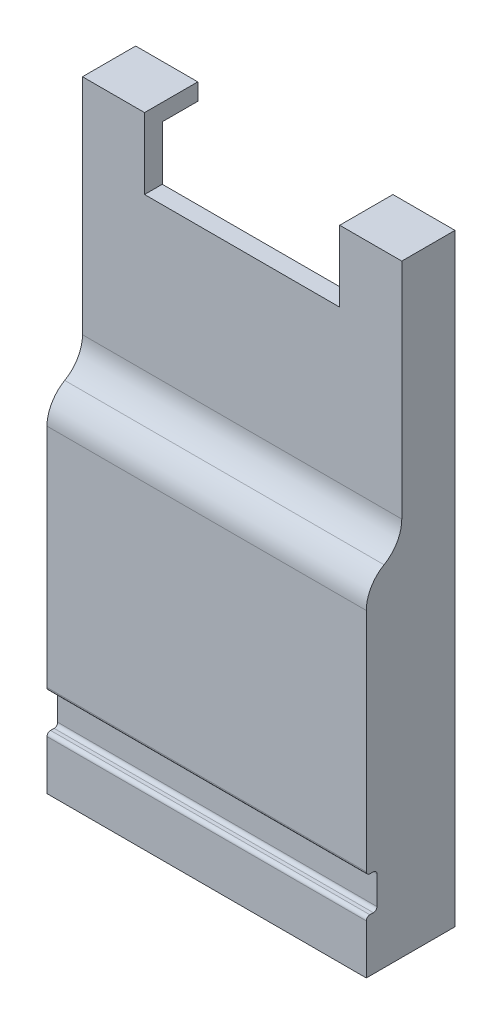
ISO-10303-21;
HEADER;
FILE_DESCRIPTION(('STEP AP214'),'2;1');
FILE_NAME('part.step','',(''),(''),'','','');
FILE_SCHEMA(('AUTOMOTIVE_DESIGN { 1 0 10303 214 1 1 1 1 }'));
ENDSEC;
DATA;
#1=APPLICATION_CONTEXT('core data for automotive mechanical design processes');
#2=APPLICATION_PROTOCOL_DEFINITION('international standard','automotive_design',2000,#1);
#3=PRODUCT_CONTEXT('',#1,'mechanical');
#4=PRODUCT('Part','Part','',(#3));
#5=PRODUCT_RELATED_PRODUCT_CATEGORY('part','',(#4));
#6=PRODUCT_DEFINITION_FORMATION('','',#4);
#7=PRODUCT_DEFINITION_CONTEXT('part definition',#1,'design');
#8=PRODUCT_DEFINITION('design','',#6,#7);
#9=PRODUCT_DEFINITION_SHAPE('','',#8);
#10=(LENGTH_UNIT() NAMED_UNIT(*) SI_UNIT(.MILLI.,.METRE.));
#11=(NAMED_UNIT(*) PLANE_ANGLE_UNIT() SI_UNIT($,.RADIAN.));
#12=(NAMED_UNIT(*) SI_UNIT($,.STERADIAN.) SOLID_ANGLE_UNIT());
#13=UNCERTAINTY_MEASURE_WITH_UNIT(LENGTH_MEASURE(1.E-05),#10,'distance_accuracy_value','');
#14=(GEOMETRIC_REPRESENTATION_CONTEXT(3) GLOBAL_UNCERTAINTY_ASSIGNED_CONTEXT((#13)) GLOBAL_UNIT_ASSIGNED_CONTEXT((#10,
#11,#12)) REPRESENTATION_CONTEXT('',''));
#15=CARTESIAN_POINT('',(0.,0.,0.));
#16=DIRECTION('',(0.,0.,1.));
#17=DIRECTION('',(1.,0.,0.));
#18=AXIS2_PLACEMENT_3D('',#15,#16,#17);
#19=CARTESIAN_POINT('',(40.25,80.25,10.));
#20=DIRECTION('',(0.,1.,0.));
#21=DIRECTION('',(0.,0.,1.));
#22=AXIS2_PLACEMENT_3D('',#19,#20,#21);
#23=PLANE('',#22);
#24=DIRECTION('',(1.,0.,0.));
#25=VECTOR('',#24,1.);
#26=CARTESIAN_POINT('',(40.25,80.25,10.));
#27=LINE('',#26,#25);
#28=CARTESIAN_POINT('',(27.5,80.25,10.));
#29=VERTEX_POINT('',#28);
#30=CARTESIAN_POINT('',(40.25,80.25,10.));
#31=VERTEX_POINT('',#30);
#32=EDGE_CURVE('E366',#29,#31,#27,.T.);
#33=ORIENTED_EDGE('',*,*,#32,.F.);
#34=DIRECTION('',(0.,0.,-1.));
#35=VECTOR('',#34,1.);
#36=CARTESIAN_POINT('',(27.5,80.25,10.));
#37=LINE('',#36,#35);
#38=CARTESIAN_POINT('',(27.5,80.25,0.));
#39=VERTEX_POINT('',#38);
#40=EDGE_CURVE('E285',#29,#39,#37,.T.);
#41=ORIENTED_EDGE('',*,*,#40,.T.);
#42=DIRECTION('',(1.,0.,0.));
#43=VECTOR('',#42,1.);
#44=CARTESIAN_POINT('',(40.25,80.25,0.));
#45=LINE('',#44,#43);
#46=CARTESIAN_POINT('',(40.25,80.25,0.));
#47=VERTEX_POINT('',#46);
#48=EDGE_CURVE('E380',#39,#47,#45,.T.);
#49=ORIENTED_EDGE('',*,*,#48,.T.);
#50=DIRECTION('',(0.,0.,-1.));
#51=VECTOR('',#50,1.);
#52=CARTESIAN_POINT('',(40.25,80.25,10.));
#53=LINE('',#52,#51);
#54=CARTESIAN_POINT('',(40.25,80.25,8.20000000000002));
#55=VERTEX_POINT('',#54);
#56=EDGE_CURVE('E398',#55,#47,#53,.T.);
#57=ORIENTED_EDGE('',*,*,#56,.F.);
#58=DIRECTION('',(1.,0.,0.));
#59=VECTOR('',#58,1.);
#60=CARTESIAN_POINT('',(39.35,80.25,8.20000000000002));
#61=LINE('',#60,#59);
#62=CARTESIAN_POINT('',(39.35,80.25,8.20000000000002));
#63=VERTEX_POINT('',#62);
#64=EDGE_CURVE('E359',#63,#55,#61,.T.);
#65=ORIENTED_EDGE('',*,*,#64,.F.);
#66=DIRECTION('',(0.,0.,-1.));
#67=VECTOR('',#66,1.);
#68=CARTESIAN_POINT('',(39.35,80.25,8.20000000000002));
#69=LINE('',#68,#67);
#70=CARTESIAN_POINT('',(39.35,80.25,8.80000000000002));
#71=VERTEX_POINT('',#70);
#72=EDGE_CURVE('E336',#71,#63,#69,.T.);
#73=ORIENTED_EDGE('',*,*,#72,.F.);
#74=DIRECTION('',(1.,0.,0.));
#75=VECTOR('',#74,1.);
#76=CARTESIAN_POINT('',(39.35,80.25,8.8));
#77=LINE('',#76,#75);
#78=CARTESIAN_POINT('',(40.25,80.25,8.80000000000002));
#79=VERTEX_POINT('',#78);
#80=EDGE_CURVE('E347',#71,#79,#77,.T.);
#81=ORIENTED_EDGE('',*,*,#80,.T.);
#82=EDGE_CURVE('E395',#31,#79,#53,.T.);
#83=ORIENTED_EDGE('',*,*,#82,.F.);
#84=EDGE_LOOP('',(#33,#41,#49,#57,#65,#73,#81,#83));
#85=FACE_BOUND('',#84,.T.);
#86=ADVANCED_FACE('F39',(#85),#23,.F.);
#87=CARTESIAN_POINT('',(-45.,85.,25.));
#88=DIRECTION('',(0.,-1.,0.));
#89=DIRECTION('',(0.,0.,-1.));
#90=AXIS2_PLACEMENT_3D('',#87,#88,#89);
#91=PLANE('',#90);
#92=DIRECTION('',(-1.,0.,0.));
#93=VECTOR('',#92,1.);
#94=CARTESIAN_POINT('',(-45.,85.,0.));
#95=LINE('',#94,#93);
#96=CARTESIAN_POINT('',(45.,85.,0.));
#97=VERTEX_POINT('',#96);
#98=CARTESIAN_POINT('',(27.5,85.,0.));
#99=VERTEX_POINT('',#98);
#100=EDGE_CURVE('E424',#97,#99,#95,.T.);
#101=ORIENTED_EDGE('',*,*,#100,.T.);
#102=DIRECTION('',(0.,0.,1.));
#103=VECTOR('',#102,1.);
#104=CARTESIAN_POINT('',(27.5,85.,25.));
#105=LINE('',#104,#103);
#106=CARTESIAN_POINT('',(27.5,85.,15.));
#107=VERTEX_POINT('',#106);
#108=EDGE_CURVE('E290',#99,#107,#105,.T.);
#109=ORIENTED_EDGE('',*,*,#108,.T.);
#110=DIRECTION('',(-1.,0.,0.));
#111=VECTOR('',#110,1.);
#112=CARTESIAN_POINT('',(45.,85.,15.));
#113=LINE('',#112,#111);
#114=CARTESIAN_POINT('',(45.,85.,15.));
#115=VERTEX_POINT('',#114);
#116=EDGE_CURVE('E404',#115,#107,#113,.T.);
#117=ORIENTED_EDGE('',*,*,#116,.F.);
#118=DIRECTION('',(0.,0.,-1.));
#119=VECTOR('',#118,1.);
#120=CARTESIAN_POINT('',(45.,85.,25.));
#121=LINE('',#120,#119);
#122=EDGE_CURVE('E441',#115,#97,#121,.T.);
#123=ORIENTED_EDGE('',*,*,#122,.T.);
#124=EDGE_LOOP('',(#101,#109,#117,#123));
#125=FACE_BOUND('',#124,.T.);
#126=ADVANCED_FACE('F534',(#125),#91,.F.);
#127=CARTESIAN_POINT('',(0.,0.,0.));
#128=DIRECTION('',(0.,0.,-1.));
#129=DIRECTION('',(-1.,0.,0.));
#130=AXIS2_PLACEMENT_3D('',#127,#128,#129);
#131=PLANE('',#130);
#132=DIRECTION('',(0.,-1.,0.));
#133=VECTOR('',#132,1.);
#134=CARTESIAN_POINT('',(27.5,0.,0.));
#135=LINE('',#134,#133);
#136=EDGE_CURVE('E288',#99,#39,#135,.T.);
#137=ORIENTED_EDGE('',*,*,#136,.F.);
#138=ORIENTED_EDGE('',*,*,#100,.F.);
#139=DIRECTION('',(0.,1.,0.));
#140=VECTOR('',#139,1.);
#141=CARTESIAN_POINT('',(45.,-85.,0.));
#142=LINE('',#141,#140);
#143=CARTESIAN_POINT('',(45.,-85.,0.));
#144=VERTEX_POINT('',#143);
#145=EDGE_CURVE('E409',#144,#97,#142,.T.);
#146=ORIENTED_EDGE('',*,*,#145,.F.);
#147=DIRECTION('',(1.,0.,0.));
#148=VECTOR('',#147,1.);
#149=CARTESIAN_POINT('',(-45.,-85.,0.));
#150=LINE('',#149,#148);
#151=CARTESIAN_POINT('',(40.25,-85.,0.));
#152=VERTEX_POINT('',#151);
#153=EDGE_CURVE('E429',#152,#144,#150,.T.);
#154=ORIENTED_EDGE('',*,*,#153,.F.);
#155=DIRECTION('',(0.,-1.,0.));
#156=VECTOR('',#155,1.);
#157=CARTESIAN_POINT('',(40.25,-85.,0.));
#158=LINE('',#157,#156);
#159=EDGE_CURVE('E367',#47,#152,#158,.T.);
#160=ORIENTED_EDGE('',*,*,#159,.F.);
#161=ORIENTED_EDGE('',*,*,#48,.F.);
#162=EDGE_LOOP('',(#137,#138,#146,#154,#160,#161));
#163=FACE_BOUND('',#162,.T.);
#164=ADVANCED_FACE('F537',(#163),#131,.T.);
#165=CARTESIAN_POINT('',(0.,0.,25.));
#166=DIRECTION('',(0.,0.,-1.));
#167=DIRECTION('',(-1.,0.,0.));
#168=AXIS2_PLACEMENT_3D('',#165,#166,#167);
#169=PLANE('',#168);
#170=DIRECTION('',(0.,-1.,0.));
#171=VECTOR('',#170,1.);
#172=CARTESIAN_POINT('',(-45.,-85.,25.));
#173=LINE('',#172,#171);
#174=CARTESIAN_POINT('',(-45.,4.70769186227474,25.));
#175=VERTEX_POINT('',#174);
#176=CARTESIAN_POINT('',(-45.,-59.0642013911507,25.));
#177=VERTEX_POINT('',#176);
#178=EDGE_CURVE('E415',#175,#177,#173,.T.);
#179=ORIENTED_EDGE('',*,*,#178,.T.);
#180=DIRECTION('',(-1.,0.,0.));
#181=VECTOR('',#180,1.);
#182=CARTESIAN_POINT('',(0.,-59.0642013911507,25.));
#183=LINE('',#182,#181);
#184=CARTESIAN_POINT('',(45.,-59.0642013911507,25.));
#185=VERTEX_POINT('',#184);
#186=EDGE_CURVE('E470',#177,#185,#183,.F.);
#187=ORIENTED_EDGE('',*,*,#186,.T.);
#188=DIRECTION('',(0.,1.,0.));
#189=VECTOR('',#188,1.);
#190=CARTESIAN_POINT('',(45.,-85.,25.));
#191=LINE('',#190,#189);
#192=CARTESIAN_POINT('',(45.,4.70769186227475,25.));
#193=VERTEX_POINT('',#192);
#194=EDGE_CURVE('E414',#185,#193,#191,.T.);
#195=ORIENTED_EDGE('',*,*,#194,.T.);
#196=DIRECTION('',(1.,0.,0.));
#197=VECTOR('',#196,1.);
#198=CARTESIAN_POINT('',(0.,4.70769186227474,25.));
#199=LINE('',#198,#197);
#200=EDGE_CURVE('E446',#193,#175,#199,.F.);
#201=ORIENTED_EDGE('',*,*,#200,.T.);
#202=EDGE_LOOP('',(#179,#187,#195,#201));
#203=FACE_BOUND('',#202,.T.);
#204=ADVANCED_FACE('F606',(#203),#169,.F.);
#205=CARTESIAN_POINT('',(-40.25,-85.,10.));
#206=DIRECTION('',(-1.,0.,0.));
#207=DIRECTION('',(0.,0.,1.));
#208=AXIS2_PLACEMENT_3D('',#205,#206,#207);
#209=PLANE('',#208);
#210=DIRECTION('',(0.,0.,-1.));
#211=VECTOR('',#210,1.);
#212=CARTESIAN_POINT('',(-40.25,-85.,10.));
#213=LINE('',#212,#211);
#214=CARTESIAN_POINT('',(-40.25,-85.,10.));
#215=VERTEX_POINT('',#214);
#216=CARTESIAN_POINT('',(-40.25,-85.,9.39999999999998));
#217=VERTEX_POINT('',#216);
#218=EDGE_CURVE('E386',#215,#217,#213,.T.);
#219=ORIENTED_EDGE('',*,*,#218,.T.);
#220=DIRECTION('',(0.,1.,0.));
#221=VECTOR('',#220,1.);
#222=CARTESIAN_POINT('',(-40.25,-85.,9.39999999999998));
#223=LINE('',#222,#221);
#224=CARTESIAN_POINT('',(-40.25,80.25,9.39999999999998));
#225=VERTEX_POINT('',#224);
#226=EDGE_CURVE('E314',#217,#225,#223,.T.);
#227=ORIENTED_EDGE('',*,*,#226,.T.);
#228=DIRECTION('',(0.,0.,-1.));
#229=VECTOR('',#228,1.);
#230=CARTESIAN_POINT('',(-40.25,80.25,10.));
#231=LINE('',#230,#229);
#232=CARTESIAN_POINT('',(-40.25,80.25,10.));
#233=VERTEX_POINT('',#232);
#234=EDGE_CURVE('E399',#233,#225,#231,.T.);
#235=ORIENTED_EDGE('',*,*,#234,.F.);
#236=DIRECTION('',(0.,1.,0.));
#237=VECTOR('',#236,1.);
#238=CARTESIAN_POINT('',(-40.25,-85.,10.));
#239=LINE('',#238,#237);
#240=EDGE_CURVE('E363',#215,#233,#239,.T.);
#241=ORIENTED_EDGE('',*,*,#240,.F.);
#242=EDGE_LOOP('',(#219,#227,#235,#241));
#243=FACE_BOUND('',#242,.T.);
#244=ADVANCED_FACE('F557',(#243),#209,.F.);
#245=CARTESIAN_POINT('',(40.25,-85.,10.));
#246=DIRECTION('',(1.,0.,0.));
#247=DIRECTION('',(0.,0.,-1.));
#248=AXIS2_PLACEMENT_3D('',#245,#246,#247);
#249=PLANE('',#248);
#250=DIRECTION('',(0.,-1.,0.));
#251=VECTOR('',#250,1.);
#252=CARTESIAN_POINT('',(40.25,-85.,8.20000000000002));
#253=LINE('',#252,#251);
#254=CARTESIAN_POINT('',(40.25,-85.,8.20000000000002));
#255=VERTEX_POINT('',#254);
#256=EDGE_CURVE('E329',#55,#255,#253,.T.);
#257=ORIENTED_EDGE('',*,*,#256,.F.);
#258=ORIENTED_EDGE('',*,*,#56,.T.);
#259=ORIENTED_EDGE('',*,*,#159,.T.);
#260=DIRECTION('',(0.,0.,-1.));
#261=VECTOR('',#260,1.);
#262=CARTESIAN_POINT('',(40.25,-85.,10.));
#263=LINE('',#262,#261);
#264=EDGE_CURVE('E394',#255,#152,#263,.T.);
#265=ORIENTED_EDGE('',*,*,#264,.F.);
#266=EDGE_LOOP('',(#257,#258,#259,#265));
#267=FACE_BOUND('',#266,.T.);
#268=ADVANCED_FACE('F638',(#267),#249,.F.);
#269=DIRECTION('',(0.,1.,0.));
#270=VECTOR('',#269,1.);
#271=CARTESIAN_POINT('',(40.25,80.25,8.8));
#272=LINE('',#271,#270);
#273=CARTESIAN_POINT('',(40.25,-85.,8.80000000000001));
#274=VERTEX_POINT('',#273);
#275=EDGE_CURVE('E340',#274,#79,#272,.T.);
#276=ORIENTED_EDGE('',*,*,#275,.F.);
#277=CARTESIAN_POINT('',(40.25,-85.,10.));
#278=VERTEX_POINT('',#277);
#279=EDGE_CURVE('E391',#278,#274,#263,.T.);
#280=ORIENTED_EDGE('',*,*,#279,.F.);
#281=DIRECTION('',(0.,-1.,0.));
#282=VECTOR('',#281,1.);
#283=CARTESIAN_POINT('',(40.25,-85.,10.));
#284=LINE('',#283,#282);
#285=EDGE_CURVE('E371',#31,#278,#284,.T.);
#286=ORIENTED_EDGE('',*,*,#285,.F.);
#287=ORIENTED_EDGE('',*,*,#82,.T.);
#288=EDGE_LOOP('',(#276,#280,#286,#287));
#289=FACE_BOUND('',#288,.T.);
#290=ADVANCED_FACE('F631',(#289),#249,.F.);
#291=CARTESIAN_POINT('',(-40.25,80.25,0.));
#292=VERTEX_POINT('',#291);
#293=CARTESIAN_POINT('',(-27.5,80.25,0.));
#294=VERTEX_POINT('',#293);
#295=EDGE_CURVE('E381',#292,#294,#45,.T.);
#296=ORIENTED_EDGE('',*,*,#295,.T.);
#297=DIRECTION('',(0.,0.,1.));
#298=VECTOR('',#297,1.);
#299=CARTESIAN_POINT('',(-27.5,80.25,10.));
#300=LINE('',#299,#298);
#301=CARTESIAN_POINT('',(-27.5,80.25,10.));
#302=VERTEX_POINT('',#301);
#303=EDGE_CURVE('E278',#294,#302,#300,.T.);
#304=ORIENTED_EDGE('',*,*,#303,.T.);
#305=EDGE_CURVE('E368',#233,#302,#27,.T.);
#306=ORIENTED_EDGE('',*,*,#305,.F.);
#307=ORIENTED_EDGE('',*,*,#234,.T.);
#308=DIRECTION('',(-1.,0.,0.));
#309=VECTOR('',#308,1.);
#310=CARTESIAN_POINT('',(-39.35,80.25,9.39999999999998));
#311=LINE('',#310,#309);
#312=CARTESIAN_POINT('',(-39.35,80.25,9.39999999999998));
#313=VERTEX_POINT('',#312);
#314=EDGE_CURVE('E327',#313,#225,#311,.T.);
#315=ORIENTED_EDGE('',*,*,#314,.F.);
#316=DIRECTION('',(0.,0.,-1.));
#317=VECTOR('',#316,1.);
#318=CARTESIAN_POINT('',(-39.35,80.25,9.39999999999998));
#319=LINE('',#318,#317);
#320=CARTESIAN_POINT('',(-39.35,80.25,8.8));
#321=VERTEX_POINT('',#320);
#322=EDGE_CURVE('E310',#313,#321,#319,.T.);
#323=ORIENTED_EDGE('',*,*,#322,.T.);
#324=DIRECTION('',(-1.,0.,0.));
#325=VECTOR('',#324,1.);
#326=CARTESIAN_POINT('',(-39.35,80.25,8.8));
#327=LINE('',#326,#325);
#328=CARTESIAN_POINT('',(-40.25,80.25,8.8));
#329=VERTEX_POINT('',#328);
#330=EDGE_CURVE('E322',#321,#329,#327,.T.);
#331=ORIENTED_EDGE('',*,*,#330,.T.);
#332=EDGE_CURVE('E377',#329,#292,#231,.T.);
#333=ORIENTED_EDGE('',*,*,#332,.T.);
#334=EDGE_LOOP('',(#296,#304,#306,#307,#315,#323,#331,#333));
#335=FACE_BOUND('',#334,.T.);
#336=ADVANCED_FACE('F503',(#335),#23,.F.);
#337=CARTESIAN_POINT('',(45.,-85.,25.));
#338=DIRECTION('',(-1.,0.,0.));
#339=DIRECTION('',(0.,0.,1.));
#340=AXIS2_PLACEMENT_3D('',#337,#338,#339);
#341=PLANE('',#340);
#342=DIRECTION('',(0.,0.,1.));
#343=VECTOR('',#342,1.);
#344=CARTESIAN_POINT('',(45.,-70.0642013911507,22.));
#345=LINE('',#344,#343);
#346=CARTESIAN_POINT('',(45.,-70.0642013911507,23.));
#347=VERTEX_POINT('',#346);
#348=CARTESIAN_POINT('',(45.,-70.0642013911507,24.));
#349=VERTEX_POINT('',#348);
#350=EDGE_CURVE('E305',#347,#349,#345,.T.);
#351=ORIENTED_EDGE('',*,*,#350,.T.);
#352=CARTESIAN_POINT('',(45.,-71.0642013911507,24.));
#353=DIRECTION('',(-1.,0.,0.));
#354=DIRECTION('',(0.,0.,1.));
#355=AXIS2_PLACEMENT_3D('',#352,#353,#354);
#356=CIRCLE('',#355,1.);
#357=CARTESIAN_POINT('',(45.,-71.0642013911507,25.));
#358=VERTEX_POINT('',#357);
#359=EDGE_CURVE('E484',#349,#358,#356,.F.);
#360=ORIENTED_EDGE('',*,*,#359,.T.);
#361=CARTESIAN_POINT('',(45.,-85.,25.));
#362=VERTEX_POINT('',#361);
#363=EDGE_CURVE('E410',#362,#358,#191,.T.);
#364=ORIENTED_EDGE('',*,*,#363,.F.);
#365=DIRECTION('',(0.,0.,-1.));
#366=VECTOR('',#365,1.);
#367=CARTESIAN_POINT('',(45.,-85.,25.));
#368=LINE('',#367,#366);
#369=EDGE_CURVE('E420',#362,#144,#368,.T.);
#370=ORIENTED_EDGE('',*,*,#369,.T.);
#371=ORIENTED_EDGE('',*,*,#145,.T.);
#372=ORIENTED_EDGE('',*,*,#122,.F.);
#373=DIRECTION('',(0.,1.,0.));
#374=VECTOR('',#373,1.);
#375=CARTESIAN_POINT('',(45.,85.,15.));
#376=LINE('',#375,#374);
#377=CARTESIAN_POINT('',(45.,22.0281999379635,15.));
#378=VERTEX_POINT('',#377);
#379=EDGE_CURVE('E389',#378,#115,#376,.T.);
#380=ORIENTED_EDGE('',*,*,#379,.F.);
#381=CARTESIAN_POINT('',(45.,22.0281999379635,25.));
#382=DIRECTION('',(-1.,0.,0.));
#383=DIRECTION('',(0.,0.,1.));
#384=AXIS2_PLACEMENT_3D('',#381,#382,#383);
#385=CIRCLE('',#384,10.);
#386=CARTESIAN_POINT('',(45.,13.3679459001191,20.));
#387=VERTEX_POINT('',#386);
#388=EDGE_CURVE('E456',#378,#387,#385,.T.);
#389=ORIENTED_EDGE('',*,*,#388,.T.);
#390=CARTESIAN_POINT('',(45.,4.70769186227474,15.));
#391=DIRECTION('',(-1.,0.,0.));
#392=DIRECTION('',(0.,0.,1.));
#393=AXIS2_PLACEMENT_3D('',#390,#391,#392);
#394=CIRCLE('',#393,10.);
#395=EDGE_CURVE('E443',#387,#193,#394,.F.);
#396=ORIENTED_EDGE('',*,*,#395,.T.);
#397=ORIENTED_EDGE('',*,*,#194,.F.);
#398=CARTESIAN_POINT('',(45.,-59.0642013911507,24.));
#399=DIRECTION('',(-1.,0.,0.));
#400=DIRECTION('',(0.,0.,1.));
#401=AXIS2_PLACEMENT_3D('',#398,#399,#400);
#402=CIRCLE('',#401,1.);
#403=CARTESIAN_POINT('',(45.,-60.0642013911507,24.));
#404=VERTEX_POINT('',#403);
#405=EDGE_CURVE('E472',#185,#404,#402,.F.);
#406=ORIENTED_EDGE('',*,*,#405,.T.);
#407=DIRECTION('',(0.,0.,1.));
#408=VECTOR('',#407,1.);
#409=CARTESIAN_POINT('',(45.,-60.0642013911507,22.));
#410=LINE('',#409,#408);
#411=CARTESIAN_POINT('',(45.,-60.0642013911507,23.));
#412=VERTEX_POINT('',#411);
#413=EDGE_CURVE('E302',#412,#404,#410,.T.);
#414=ORIENTED_EDGE('',*,*,#413,.F.);
#415=CARTESIAN_POINT('',(45.,-61.0642013911507,23.));
#416=DIRECTION('',(-1.,0.,0.));
#417=DIRECTION('',(0.,0.,1.));
#418=AXIS2_PLACEMENT_3D('',#415,#416,#417);
#419=CIRCLE('',#418,1.);
#420=CARTESIAN_POINT('',(45.,-61.0642013911507,22.));
#421=VERTEX_POINT('',#420);
#422=EDGE_CURVE('E476',#412,#421,#419,.T.);
#423=ORIENTED_EDGE('',*,*,#422,.T.);
#424=DIRECTION('',(0.,1.,0.));
#425=VECTOR('',#424,1.);
#426=CARTESIAN_POINT('',(45.,-70.0642013911507,22.));
#427=LINE('',#426,#425);
#428=CARTESIAN_POINT('',(45.,-69.0642013911507,22.));
#429=VERTEX_POINT('',#428);
#430=EDGE_CURVE('E295',#429,#421,#427,.T.);
#431=ORIENTED_EDGE('',*,*,#430,.F.);
#432=CARTESIAN_POINT('',(45.,-69.0642013911507,23.));
#433=DIRECTION('',(-1.,0.,0.));
#434=DIRECTION('',(0.,0.,1.));
#435=AXIS2_PLACEMENT_3D('',#432,#433,#434);
#436=CIRCLE('',#435,1.);
#437=EDGE_CURVE('E493',#429,#347,#436,.T.);
#438=ORIENTED_EDGE('',*,*,#437,.T.);
#439=EDGE_LOOP('',(#351,#360,#364,#370,#371,#372,#380,#389,#396,#397,#406,#414,#423,#431,#438));
#440=FACE_BOUND('',#439,.T.);
#441=ADVANCED_FACE('F529',(#440),#341,.F.);
#442=CARTESIAN_POINT('',(-27.5,85.,15.));
#443=VERTEX_POINT('',#442);
#444=CARTESIAN_POINT('',(-45.,85.,15.));
#445=VERTEX_POINT('',#444);
#446=EDGE_CURVE('E403',#443,#445,#113,.T.);
#447=ORIENTED_EDGE('',*,*,#446,.F.);
#448=DIRECTION('',(0.,0.,-1.));
#449=VECTOR('',#448,1.);
#450=CARTESIAN_POINT('',(-27.5,85.,25.));
#451=LINE('',#450,#449);
#452=CARTESIAN_POINT('',(-27.5,85.,0.));
#453=VERTEX_POINT('',#452);
#454=EDGE_CURVE('E268',#443,#453,#451,.T.);
#455=ORIENTED_EDGE('',*,*,#454,.T.);
#456=CARTESIAN_POINT('',(-45.,85.,0.));
#457=VERTEX_POINT('',#456);
#458=EDGE_CURVE('E423',#453,#457,#95,.T.);
#459=ORIENTED_EDGE('',*,*,#458,.T.);
#460=DIRECTION('',(0.,0.,-1.));
#461=VECTOR('',#460,1.);
#462=CARTESIAN_POINT('',(-45.,85.,25.));
#463=LINE('',#462,#461);
#464=EDGE_CURVE('E438',#445,#457,#463,.T.);
#465=ORIENTED_EDGE('',*,*,#464,.F.);
#466=EDGE_LOOP('',(#447,#455,#459,#465));
#467=FACE_BOUND('',#466,.T.);
#468=ADVANCED_FACE('F513',(#467),#91,.F.);
#469=CARTESIAN_POINT('',(-45.,-85.,25.));
#470=DIRECTION('',(1.,0.,0.));
#471=DIRECTION('',(0.,0.,-1.));
#472=AXIS2_PLACEMENT_3D('',#469,#470,#471);
#473=PLANE('',#472);
#474=CARTESIAN_POINT('',(-45.,-71.0642013911507,25.));
#475=VERTEX_POINT('',#474);
#476=CARTESIAN_POINT('',(-45.,-85.,25.));
#477=VERTEX_POINT('',#476);
#478=EDGE_CURVE('E413',#475,#477,#173,.T.);
#479=ORIENTED_EDGE('',*,*,#478,.F.);
#480=CARTESIAN_POINT('',(-45.,-71.0642013911507,24.));
#481=DIRECTION('',(1.,0.,0.));
#482=DIRECTION('',(0.,0.,-1.));
#483=AXIS2_PLACEMENT_3D('',#480,#481,#482);
#484=CIRCLE('',#483,1.);
#485=CARTESIAN_POINT('',(-45.,-70.0642013911507,24.));
#486=VERTEX_POINT('',#485);
#487=EDGE_CURVE('E488',#475,#486,#484,.F.);
#488=ORIENTED_EDGE('',*,*,#487,.T.);
#489=DIRECTION('',(0.,0.,1.));
#490=VECTOR('',#489,1.);
#491=CARTESIAN_POINT('',(-45.,-70.0642013911507,22.));
#492=LINE('',#491,#490);
#493=CARTESIAN_POINT('',(-45.,-70.0642013911507,23.));
#494=VERTEX_POINT('',#493);
#495=EDGE_CURVE('E297',#494,#486,#492,.T.);
#496=ORIENTED_EDGE('',*,*,#495,.F.);
#497=CARTESIAN_POINT('',(-45.,-69.0642013911507,23.));
#498=DIRECTION('',(1.,0.,0.));
#499=DIRECTION('',(0.,0.,-1.));
#500=AXIS2_PLACEMENT_3D('',#497,#498,#499);
#501=CIRCLE('',#500,1.);
#502=CARTESIAN_POINT('',(-45.,-69.0642013911507,22.));
#503=VERTEX_POINT('',#502);
#504=EDGE_CURVE('E62',#494,#503,#501,.T.);
#505=ORIENTED_EDGE('',*,*,#504,.T.);
#506=DIRECTION('',(0.,-1.,0.));
#507=VECTOR('',#506,1.);
#508=CARTESIAN_POINT('',(-45.,-70.0642013911507,22.));
#509=LINE('',#508,#507);
#510=CARTESIAN_POINT('',(-45.,-61.0642013911507,22.));
#511=VERTEX_POINT('',#510);
#512=EDGE_CURVE('E293',#511,#503,#509,.T.);
#513=ORIENTED_EDGE('',*,*,#512,.F.);
#514=CARTESIAN_POINT('',(-45.,-61.0642013911507,23.));
#515=DIRECTION('',(1.,0.,0.));
#516=DIRECTION('',(0.,0.,-1.));
#517=AXIS2_PLACEMENT_3D('',#514,#515,#516);
#518=CIRCLE('',#517,1.);
#519=CARTESIAN_POINT('',(-45.,-60.0642013911507,23.));
#520=VERTEX_POINT('',#519);
#521=EDGE_CURVE('E474',#511,#520,#518,.T.);
#522=ORIENTED_EDGE('',*,*,#521,.T.);
#523=DIRECTION('',(0.,0.,1.));
#524=VECTOR('',#523,1.);
#525=CARTESIAN_POINT('',(-45.,-60.0642013911507,22.));
#526=LINE('',#525,#524);
#527=CARTESIAN_POINT('',(-45.,-60.0642013911507,24.));
#528=VERTEX_POINT('',#527);
#529=EDGE_CURVE('E298',#520,#528,#526,.T.);
#530=ORIENTED_EDGE('',*,*,#529,.T.);
#531=CARTESIAN_POINT('',(-45.,-59.0642013911507,24.));
#532=DIRECTION('',(1.,0.,0.));
#533=DIRECTION('',(0.,0.,-1.));
#534=AXIS2_PLACEMENT_3D('',#531,#532,#533);
#535=CIRCLE('',#534,1.);
#536=EDGE_CURVE('E468',#528,#177,#535,.F.);
#537=ORIENTED_EDGE('',*,*,#536,.T.);
#538=ORIENTED_EDGE('',*,*,#178,.F.);
#539=CARTESIAN_POINT('',(-45.,4.70769186227473,15.));
#540=DIRECTION('',(1.,0.,0.));
#541=DIRECTION('',(0.,0.,-1.));
#542=AXIS2_PLACEMENT_3D('',#539,#540,#541);
#543=CIRCLE('',#542,10.);
#544=CARTESIAN_POINT('',(-45.,13.3679459001191,20.));
#545=VERTEX_POINT('',#544);
#546=EDGE_CURVE('E448',#175,#545,#543,.F.);
#547=ORIENTED_EDGE('',*,*,#546,.T.);
#548=CARTESIAN_POINT('',(-45.,22.0281999379635,25.));
#549=DIRECTION('',(1.,0.,0.));
#550=DIRECTION('',(0.,0.,-1.));
#551=AXIS2_PLACEMENT_3D('',#548,#549,#550);
#552=CIRCLE('',#551,10.);
#553=CARTESIAN_POINT('',(-45.,22.0281999379635,15.));
#554=VERTEX_POINT('',#553);
#555=EDGE_CURVE('E458',#545,#554,#552,.T.);
#556=ORIENTED_EDGE('',*,*,#555,.T.);
#557=DIRECTION('',(0.,-1.,0.));
#558=VECTOR('',#557,1.);
#559=CARTESIAN_POINT('',(-45.,85.,15.));
#560=LINE('',#559,#558);
#561=EDGE_CURVE('E406',#445,#554,#560,.T.);
#562=ORIENTED_EDGE('',*,*,#561,.F.);
#563=ORIENTED_EDGE('',*,*,#464,.T.);
#564=DIRECTION('',(0.,-1.,0.));
#565=VECTOR('',#564,1.);
#566=CARTESIAN_POINT('',(-45.,-85.,0.));
#567=LINE('',#566,#565);
#568=CARTESIAN_POINT('',(-45.,-85.,0.));
#569=VERTEX_POINT('',#568);
#570=EDGE_CURVE('E427',#457,#569,#567,.T.);
#571=ORIENTED_EDGE('',*,*,#570,.T.);
#572=DIRECTION('',(0.,0.,-1.));
#573=VECTOR('',#572,1.);
#574=CARTESIAN_POINT('',(-45.,-85.,25.));
#575=LINE('',#574,#573);
#576=EDGE_CURVE('E435',#477,#569,#575,.T.);
#577=ORIENTED_EDGE('',*,*,#576,.F.);
#578=EDGE_LOOP('',(#479,#488,#496,#505,#513,#522,#530,#537,#538,#547,#556,#562,#563,#571,#577));
#579=FACE_BOUND('',#578,.T.);
#580=ADVANCED_FACE('F518',(#579),#473,.F.);
#581=CARTESIAN_POINT('',(-45.,-85.,25.));
#582=DIRECTION('',(0.,1.,0.));
#583=DIRECTION('',(0.,0.,1.));
#584=AXIS2_PLACEMENT_3D('',#581,#582,#583);
#585=PLANE('',#584);
#586=CARTESIAN_POINT('',(-40.25,-85.,0.));
#587=VERTEX_POINT('',#586);
#588=EDGE_CURVE('E430',#569,#587,#150,.T.);
#589=ORIENTED_EDGE('',*,*,#588,.T.);
#590=CARTESIAN_POINT('',(-40.25,-85.,8.79999999999999));
#591=VERTEX_POINT('',#590);
#592=EDGE_CURVE('E390',#591,#587,#213,.T.);
#593=ORIENTED_EDGE('',*,*,#592,.F.);
#594=DIRECTION('',(-1.,0.,0.));
#595=VECTOR('',#594,1.);
#596=CARTESIAN_POINT('',(-39.35,-85.,8.79999999999998));
#597=LINE('',#596,#595);
#598=CARTESIAN_POINT('',(-39.35,-85.,8.79999999999998));
#599=VERTEX_POINT('',#598);
#600=EDGE_CURVE('E332',#599,#591,#597,.T.);
#601=ORIENTED_EDGE('',*,*,#600,.F.);
#602=DIRECTION('',(0.,0.,-1.));
#603=VECTOR('',#602,1.);
#604=CARTESIAN_POINT('',(-39.35,-85.,9.39999999999998));
#605=LINE('',#604,#603);
#606=CARTESIAN_POINT('',(-39.35,-85.,9.39999999999998));
#607=VERTEX_POINT('',#606);
#608=EDGE_CURVE('E317',#607,#599,#605,.T.);
#609=ORIENTED_EDGE('',*,*,#608,.F.);
#610=DIRECTION('',(-1.,0.,0.));
#611=VECTOR('',#610,1.);
#612=CARTESIAN_POINT('',(-39.35,-85.,9.39999999999998));
#613=LINE('',#612,#611);
#614=EDGE_CURVE('E330',#607,#217,#613,.T.);
#615=ORIENTED_EDGE('',*,*,#614,.T.);
#616=ORIENTED_EDGE('',*,*,#218,.F.);
#617=DIRECTION('',(-1.,0.,0.));
#618=VECTOR('',#617,1.);
#619=CARTESIAN_POINT('',(40.25,-85.,10.));
#620=LINE('',#619,#618);
#621=EDGE_CURVE('E374',#278,#215,#620,.T.);
#622=ORIENTED_EDGE('',*,*,#621,.F.);
#623=ORIENTED_EDGE('',*,*,#279,.T.);
#624=DIRECTION('',(1.,0.,0.));
#625=VECTOR('',#624,1.);
#626=CARTESIAN_POINT('',(39.35,-85.,8.80000000000002));
#627=LINE('',#626,#625);
#628=CARTESIAN_POINT('',(39.35,-85.,8.80000000000002));
#629=VERTEX_POINT('',#628);
#630=EDGE_CURVE('E353',#629,#274,#627,.T.);
#631=ORIENTED_EDGE('',*,*,#630,.F.);
#632=DIRECTION('',(0.,0.,1.));
#633=VECTOR('',#632,1.);
#634=CARTESIAN_POINT('',(39.35,-85.,8.80000000000002));
#635=LINE('',#634,#633);
#636=CARTESIAN_POINT('',(39.35,-85.,8.20000000000002));
#637=VERTEX_POINT('',#636);
#638=EDGE_CURVE('E342',#637,#629,#635,.T.);
#639=ORIENTED_EDGE('',*,*,#638,.F.);
#640=DIRECTION('',(1.,0.,0.));
#641=VECTOR('',#640,1.);
#642=CARTESIAN_POINT('',(39.35,-85.,8.20000000000002));
#643=LINE('',#642,#641);
#644=EDGE_CURVE('E356',#637,#255,#643,.T.);
#645=ORIENTED_EDGE('',*,*,#644,.T.);
#646=ORIENTED_EDGE('',*,*,#264,.T.);
#647=ORIENTED_EDGE('',*,*,#153,.T.);
#648=ORIENTED_EDGE('',*,*,#369,.F.);
#649=DIRECTION('',(1.,0.,0.));
#650=VECTOR('',#649,1.);
#651=CARTESIAN_POINT('',(-45.,-85.,25.));
#652=LINE('',#651,#650);
#653=EDGE_CURVE('E418',#477,#362,#652,.T.);
#654=ORIENTED_EDGE('',*,*,#653,.F.);
#655=ORIENTED_EDGE('',*,*,#576,.T.);
#656=EDGE_LOOP('',(#589,#593,#601,#609,#615,#616,#622,#623,#631,#639,#645,#646,#647,#648,#654,#655));
#657=FACE_BOUND('',#656,.T.);
#658=ADVANCED_FACE('F552',(#657),#585,.F.);
#659=ORIENTED_EDGE('',*,*,#363,.T.);
#660=DIRECTION('',(1.,0.,0.));
#661=VECTOR('',#660,1.);
#662=CARTESIAN_POINT('',(0.,-71.0642013911507,25.));
#663=LINE('',#662,#661);
#664=EDGE_CURVE('E486',#358,#475,#663,.F.);
#665=ORIENTED_EDGE('',*,*,#664,.T.);
#666=ORIENTED_EDGE('',*,*,#478,.T.);
#667=ORIENTED_EDGE('',*,*,#653,.T.);
#668=EDGE_LOOP('',(#659,#665,#666,#667));
#669=FACE_BOUND('',#668,.T.);
#670=ADVANCED_FACE('F577',(#669),#169,.F.);
#671=DIRECTION('',(0.,1.,0.));
#672=VECTOR('',#671,1.);
#673=CARTESIAN_POINT('',(-27.5,0.,0.));
#674=LINE('',#673,#672);
#675=EDGE_CURVE('E282',#294,#453,#674,.T.);
#676=ORIENTED_EDGE('',*,*,#675,.F.);
#677=ORIENTED_EDGE('',*,*,#295,.F.);
#678=DIRECTION('',(0.,1.,0.));
#679=VECTOR('',#678,1.);
#680=CARTESIAN_POINT('',(-40.25,-85.,0.));
#681=LINE('',#680,#679);
#682=EDGE_CURVE('E362',#587,#292,#681,.T.);
#683=ORIENTED_EDGE('',*,*,#682,.F.);
#684=ORIENTED_EDGE('',*,*,#588,.F.);
#685=ORIENTED_EDGE('',*,*,#570,.F.);
#686=ORIENTED_EDGE('',*,*,#458,.F.);
#687=EDGE_LOOP('',(#676,#677,#683,#684,#685,#686));
#688=FACE_BOUND('',#687,.T.);
#689=ADVANCED_FACE('F508',(#688),#131,.T.);
#690=CARTESIAN_POINT('',(0.,0.,15.));
#691=DIRECTION('',(0.,0.,-1.));
#692=DIRECTION('',(-1.,0.,0.));
#693=AXIS2_PLACEMENT_3D('',#690,#691,#692);
#694=PLANE('',#693);
#695=ORIENTED_EDGE('',*,*,#116,.T.);
#696=DIRECTION('',(0.,1.,0.));
#697=VECTOR('',#696,1.);
#698=CARTESIAN_POINT('',(27.5,105.,15.));
#699=LINE('',#698,#697);
#700=CARTESIAN_POINT('',(27.5,65.,15.));
#701=VERTEX_POINT('',#700);
#702=EDGE_CURVE('E271',#701,#107,#699,.T.);
#703=ORIENTED_EDGE('',*,*,#702,.F.);
#704=DIRECTION('',(1.,0.,0.));
#705=VECTOR('',#704,1.);
#706=CARTESIAN_POINT('',(-27.5,65.,15.));
#707=LINE('',#706,#705);
#708=CARTESIAN_POINT('',(-27.5,65.,15.));
#709=VERTEX_POINT('',#708);
#710=EDGE_CURVE('E258',#709,#701,#707,.T.);
#711=ORIENTED_EDGE('',*,*,#710,.F.);
#712=DIRECTION('',(0.,-1.,0.));
#713=VECTOR('',#712,1.);
#714=CARTESIAN_POINT('',(-27.5,105.,15.));
#715=LINE('',#714,#713);
#716=EDGE_CURVE('E265',#443,#709,#715,.T.);
#717=ORIENTED_EDGE('',*,*,#716,.F.);
#718=ORIENTED_EDGE('',*,*,#446,.T.);
#719=ORIENTED_EDGE('',*,*,#561,.T.);
#720=DIRECTION('',(1.,0.,0.));
#721=VECTOR('',#720,1.);
#722=CARTESIAN_POINT('',(0.,22.0281999379635,15.));
#723=LINE('',#722,#721);
#724=EDGE_CURVE('E451',#554,#378,#723,.T.);
#725=ORIENTED_EDGE('',*,*,#724,.T.);
#726=ORIENTED_EDGE('',*,*,#379,.T.);
#727=EDGE_LOOP('',(#695,#703,#711,#717,#718,#719,#725,#726));
#728=FACE_BOUND('',#727,.T.);
#729=ADVANCED_FACE('F274',(#728),#694,.F.);
#730=CARTESIAN_POINT('',(45.,4.70769186227474,15.));
#731=DIRECTION('',(1.,0.,0.));
#732=DIRECTION('',(0.,1.,0.));
#733=AXIS2_PLACEMENT_3D('',#730,#731,#732);
#734=CYLINDRICAL_SURFACE('',#733,10.);
#735=ORIENTED_EDGE('',*,*,#395,.F.);
#736=DIRECTION('',(1.,0.,0.));
#737=VECTOR('',#736,1.);
#738=CARTESIAN_POINT('',(45.,13.3679459001191,20.));
#739=LINE('',#738,#737);
#740=EDGE_CURVE('E454',#387,#545,#739,.F.);
#741=ORIENTED_EDGE('',*,*,#740,.T.);
#742=ORIENTED_EDGE('',*,*,#546,.F.);
#743=ORIENTED_EDGE('',*,*,#200,.F.);
#744=EDGE_LOOP('',(#735,#741,#742,#743));
#745=FACE_BOUND('',#744,.T.);
#746=ADVANCED_FACE('F610',(#745),#734,.T.);
#747=CARTESIAN_POINT('',(45.,22.0281999379635,25.));
#748=DIRECTION('',(1.,0.,0.));
#749=DIRECTION('',(0.,1.,0.));
#750=AXIS2_PLACEMENT_3D('',#747,#748,#749);
#751=CYLINDRICAL_SURFACE('',#750,10.);
#752=ORIENTED_EDGE('',*,*,#555,.F.);
#753=ORIENTED_EDGE('',*,*,#740,.F.);
#754=ORIENTED_EDGE('',*,*,#388,.F.);
#755=ORIENTED_EDGE('',*,*,#724,.F.);
#756=EDGE_LOOP('',(#752,#753,#754,#755));
#757=FACE_BOUND('',#756,.T.);
#758=ADVANCED_FACE('F524',(#757),#751,.F.);
#759=ORIENTED_EDGE('',*,*,#332,.F.);
#760=DIRECTION('',(0.,-1.,0.));
#761=VECTOR('',#760,1.);
#762=CARTESIAN_POINT('',(-40.25,80.25,8.8));
#763=LINE('',#762,#761);
#764=EDGE_CURVE('E301',#329,#591,#763,.T.);
#765=ORIENTED_EDGE('',*,*,#764,.T.);
#766=ORIENTED_EDGE('',*,*,#592,.T.);
#767=ORIENTED_EDGE('',*,*,#682,.T.);
#768=EDGE_LOOP('',(#759,#765,#766,#767));
#769=FACE_BOUND('',#768,.T.);
#770=ADVANCED_FACE('F569',(#769),#209,.F.);
#771=CARTESIAN_POINT('',(0.,0.,10.));
#772=DIRECTION('',(0.,0.,1.));
#773=DIRECTION('',(1.,0.,0.));
#774=AXIS2_PLACEMENT_3D('',#771,#772,#773);
#775=PLANE('',#774);
#776=DIRECTION('',(1.,0.,0.));
#777=VECTOR('',#776,1.);
#778=CARTESIAN_POINT('',(0.,65.,10.));
#779=LINE('',#778,#777);
#780=CARTESIAN_POINT('',(-27.5,65.,10.));
#781=VERTEX_POINT('',#780);
#782=CARTESIAN_POINT('',(27.5,65.,10.));
#783=VERTEX_POINT('',#782);
#784=EDGE_CURVE('E47',#781,#783,#779,.T.);
#785=ORIENTED_EDGE('',*,*,#784,.T.);
#786=DIRECTION('',(0.,1.,0.));
#787=VECTOR('',#786,1.);
#788=CARTESIAN_POINT('',(27.5,0.,10.));
#789=LINE('',#788,#787);
#790=EDGE_CURVE('E11',#783,#29,#789,.T.);
#791=ORIENTED_EDGE('',*,*,#790,.T.);
#792=ORIENTED_EDGE('',*,*,#32,.T.);
#793=ORIENTED_EDGE('',*,*,#285,.T.);
#794=ORIENTED_EDGE('',*,*,#621,.T.);
#795=ORIENTED_EDGE('',*,*,#240,.T.);
#796=ORIENTED_EDGE('',*,*,#305,.T.);
#797=DIRECTION('',(0.,-1.,0.));
#798=VECTOR('',#797,1.);
#799=CARTESIAN_POINT('',(-27.5,0.,10.));
#800=LINE('',#799,#798);
#801=EDGE_CURVE('E496',#302,#781,#800,.T.);
#802=ORIENTED_EDGE('',*,*,#801,.T.);
#803=EDGE_LOOP('',(#785,#791,#792,#793,#794,#795,#796,#802));
#804=FACE_BOUND('',#803,.T.);
#805=ADVANCED_FACE('F498',(#804),#775,.F.);
#806=CARTESIAN_POINT('',(39.35,-85.,8.20000000000002));
#807=DIRECTION('',(0.,0.,1.));
#808=DIRECTION('',(1.,0.,0.));
#809=AXIS2_PLACEMENT_3D('',#806,#807,#808);
#810=PLANE('',#809);
#811=ORIENTED_EDGE('',*,*,#256,.T.);
#812=ORIENTED_EDGE('',*,*,#644,.F.);
#813=DIRECTION('',(0.,-1.,0.));
#814=VECTOR('',#813,1.);
#815=CARTESIAN_POINT('',(39.35,-85.,8.20000000000002));
#816=LINE('',#815,#814);
#817=EDGE_CURVE('E339',#63,#637,#816,.T.);
#818=ORIENTED_EDGE('',*,*,#817,.F.);
#819=ORIENTED_EDGE('',*,*,#64,.T.);
#820=EDGE_LOOP('',(#811,#812,#818,#819));
#821=FACE_BOUND('',#820,.T.);
#822=ADVANCED_FACE('F646',(#821),#810,.F.);
#823=CARTESIAN_POINT('',(39.35,80.25,8.8));
#824=DIRECTION('',(0.,0.,-1.));
#825=DIRECTION('',(0.,1.,0.));
#826=AXIS2_PLACEMENT_3D('',#823,#824,#825);
#827=PLANE('',#826);
#828=ORIENTED_EDGE('',*,*,#275,.T.);
#829=ORIENTED_EDGE('',*,*,#80,.F.);
#830=DIRECTION('',(0.,1.,0.));
#831=VECTOR('',#830,1.);
#832=CARTESIAN_POINT('',(39.35,80.25,8.8));
#833=LINE('',#832,#831);
#834=EDGE_CURVE('E344',#629,#71,#833,.T.);
#835=ORIENTED_EDGE('',*,*,#834,.F.);
#836=ORIENTED_EDGE('',*,*,#630,.T.);
#837=EDGE_LOOP('',(#828,#829,#835,#836));
#838=FACE_BOUND('',#837,.T.);
#839=ADVANCED_FACE('F649',(#838),#827,.F.);
#840=CARTESIAN_POINT('',(39.35,0.,0.));
#841=DIRECTION('',(1.,0.,0.));
#842=DIRECTION('',(0.,0.,-1.));
#843=AXIS2_PLACEMENT_3D('',#840,#841,#842);
#844=PLANE('',#843);
#845=ORIENTED_EDGE('',*,*,#72,.T.);
#846=ORIENTED_EDGE('',*,*,#817,.T.);
#847=ORIENTED_EDGE('',*,*,#638,.T.);
#848=ORIENTED_EDGE('',*,*,#834,.T.);
#849=EDGE_LOOP('',(#845,#846,#847,#848));
#850=FACE_BOUND('',#849,.T.);
#851=ADVANCED_FACE('F653',(#850),#844,.F.);
#852=CARTESIAN_POINT('',(-39.35,-85.,9.39999999999998));
#853=DIRECTION('',(0.,0.,1.));
#854=DIRECTION('',(1.,0.,0.));
#855=AXIS2_PLACEMENT_3D('',#852,#853,#854);
#856=PLANE('',#855);
#857=ORIENTED_EDGE('',*,*,#226,.F.);
#858=ORIENTED_EDGE('',*,*,#614,.F.);
#859=DIRECTION('',(0.,1.,0.));
#860=VECTOR('',#859,1.);
#861=CARTESIAN_POINT('',(-39.35,-85.,9.39999999999998));
#862=LINE('',#861,#860);
#863=EDGE_CURVE('E319',#607,#313,#862,.T.);
#864=ORIENTED_EDGE('',*,*,#863,.T.);
#865=ORIENTED_EDGE('',*,*,#314,.T.);
#866=EDGE_LOOP('',(#857,#858,#864,#865));
#867=FACE_BOUND('',#866,.T.);
#868=ADVANCED_FACE('F560',(#867),#856,.T.);
#869=CARTESIAN_POINT('',(-39.35,80.25,8.8));
#870=DIRECTION('',(0.,0.,-1.));
#871=DIRECTION('',(0.,1.,0.));
#872=AXIS2_PLACEMENT_3D('',#869,#870,#871);
#873=PLANE('',#872);
#874=ORIENTED_EDGE('',*,*,#764,.F.);
#875=ORIENTED_EDGE('',*,*,#330,.F.);
#876=DIRECTION('',(0.,-1.,0.));
#877=VECTOR('',#876,1.);
#878=CARTESIAN_POINT('',(-39.35,80.25,8.8));
#879=LINE('',#878,#877);
#880=EDGE_CURVE('E313',#321,#599,#879,.T.);
#881=ORIENTED_EDGE('',*,*,#880,.T.);
#882=ORIENTED_EDGE('',*,*,#600,.T.);
#883=EDGE_LOOP('',(#874,#875,#881,#882));
#884=FACE_BOUND('',#883,.T.);
#885=ADVANCED_FACE('F567',(#884),#873,.T.);
#886=CARTESIAN_POINT('',(-39.35,0.,0.));
#887=DIRECTION('',(-1.,0.,0.));
#888=DIRECTION('',(0.,-1.,0.));
#889=AXIS2_PLACEMENT_3D('',#886,#887,#888);
#890=PLANE('',#889);
#891=ORIENTED_EDGE('',*,*,#322,.F.);
#892=ORIENTED_EDGE('',*,*,#863,.F.);
#893=ORIENTED_EDGE('',*,*,#608,.T.);
#894=ORIENTED_EDGE('',*,*,#880,.F.);
#895=EDGE_LOOP('',(#891,#892,#893,#894));
#896=FACE_BOUND('',#895,.T.);
#897=ADVANCED_FACE('F563',(#896),#890,.F.);
#898=CARTESIAN_POINT('',(-45.,-60.0642013911507,22.));
#899=DIRECTION('',(0.,1.,0.));
#900=DIRECTION('',(0.,0.,1.));
#901=AXIS2_PLACEMENT_3D('',#898,#899,#900);
#902=PLANE('',#901);
#903=ORIENTED_EDGE('',*,*,#529,.F.);
#904=DIRECTION('',(-1.,0.,0.));
#905=VECTOR('',#904,1.);
#906=CARTESIAN_POINT('',(45.,-60.0642013911507,23.));
#907=LINE('',#906,#905);
#908=EDGE_CURVE('E466',#520,#412,#907,.F.);
#909=ORIENTED_EDGE('',*,*,#908,.T.);
#910=ORIENTED_EDGE('',*,*,#413,.T.);
#911=DIRECTION('',(-1.,0.,0.));
#912=VECTOR('',#911,1.);
#913=CARTESIAN_POINT('',(-45.,-60.0642013911507,24.));
#914=LINE('',#913,#912);
#915=EDGE_CURVE('E463',#404,#528,#914,.T.);
#916=ORIENTED_EDGE('',*,*,#915,.T.);
#917=EDGE_LOOP('',(#903,#909,#910,#916));
#918=FACE_BOUND('',#917,.T.);
#919=ADVANCED_FACE('F599',(#918),#902,.F.);
#920=CARTESIAN_POINT('',(-45.,-70.0642013911507,22.));
#921=DIRECTION('',(0.,-1.,0.));
#922=DIRECTION('',(0.,0.,-1.));
#923=AXIS2_PLACEMENT_3D('',#920,#921,#922);
#924=PLANE('',#923);
#925=ORIENTED_EDGE('',*,*,#495,.T.);
#926=DIRECTION('',(1.,0.,0.));
#927=VECTOR('',#926,1.);
#928=CARTESIAN_POINT('',(-45.,-70.0642013911507,24.));
#929=LINE('',#928,#927);
#930=EDGE_CURVE('E481',#486,#349,#929,.T.);
#931=ORIENTED_EDGE('',*,*,#930,.T.);
#932=ORIENTED_EDGE('',*,*,#350,.F.);
#933=DIRECTION('',(1.,0.,0.));
#934=VECTOR('',#933,1.);
#935=CARTESIAN_POINT('',(-45.,-70.0642013911507,23.));
#936=LINE('',#935,#934);
#937=EDGE_CURVE('E479',#347,#494,#936,.F.);
#938=ORIENTED_EDGE('',*,*,#937,.T.);
#939=EDGE_LOOP('',(#925,#931,#932,#938));
#940=FACE_BOUND('',#939,.T.);
#941=ADVANCED_FACE('F583',(#940),#924,.F.);
#942=CARTESIAN_POINT('',(0.,0.,22.));
#943=DIRECTION('',(0.,0.,-1.));
#944=DIRECTION('',(-1.,0.,0.));
#945=AXIS2_PLACEMENT_3D('',#942,#943,#944);
#946=PLANE('',#945);
#947=ORIENTED_EDGE('',*,*,#512,.T.);
#948=DIRECTION('',(1.,0.,0.));
#949=VECTOR('',#948,1.);
#950=CARTESIAN_POINT('',(45.,-69.0642013911507,22.));
#951=LINE('',#950,#949);
#952=EDGE_CURVE('E490',#503,#429,#951,.T.);
#953=ORIENTED_EDGE('',*,*,#952,.T.);
#954=ORIENTED_EDGE('',*,*,#430,.T.);
#955=DIRECTION('',(-1.,0.,0.));
#956=VECTOR('',#955,1.);
#957=CARTESIAN_POINT('',(-45.,-61.0642013911507,22.));
#958=LINE('',#957,#956);
#959=EDGE_CURVE('E460',#421,#511,#958,.T.);
#960=ORIENTED_EDGE('',*,*,#959,.T.);
#961=EDGE_LOOP('',(#947,#953,#954,#960));
#962=FACE_BOUND('',#961,.T.);
#963=ADVANCED_FACE('F590',(#962),#946,.F.);
#964=CARTESIAN_POINT('',(0.,-61.0642013911507,23.));
#965=DIRECTION('',(1.,0.,0.));
#966=DIRECTION('',(0.,0.,-1.));
#967=AXIS2_PLACEMENT_3D('',#964,#965,#966);
#968=CYLINDRICAL_SURFACE('',#967,1.);
#969=ORIENTED_EDGE('',*,*,#422,.F.);
#970=ORIENTED_EDGE('',*,*,#908,.F.);
#971=ORIENTED_EDGE('',*,*,#521,.F.);
#972=ORIENTED_EDGE('',*,*,#959,.F.);
#973=EDGE_LOOP('',(#969,#970,#971,#972));
#974=FACE_BOUND('',#973,.T.);
#975=ADVANCED_FACE('F596',(#974),#968,.F.);
#976=CARTESIAN_POINT('',(-45.,-59.0642013911507,24.));
#977=DIRECTION('',(-1.,0.,0.));
#978=DIRECTION('',(0.,0.,1.));
#979=AXIS2_PLACEMENT_3D('',#976,#977,#978);
#980=CYLINDRICAL_SURFACE('',#979,1.);
#981=ORIENTED_EDGE('',*,*,#405,.F.);
#982=ORIENTED_EDGE('',*,*,#186,.F.);
#983=ORIENTED_EDGE('',*,*,#536,.F.);
#984=ORIENTED_EDGE('',*,*,#915,.F.);
#985=EDGE_LOOP('',(#981,#982,#983,#984));
#986=FACE_BOUND('',#985,.T.);
#987=ADVANCED_FACE('F603',(#986),#980,.T.);
#988=CARTESIAN_POINT('',(-45.,-71.0642013911507,24.));
#989=DIRECTION('',(1.,0.,0.));
#990=DIRECTION('',(0.,0.,-1.));
#991=AXIS2_PLACEMENT_3D('',#988,#989,#990);
#992=CYLINDRICAL_SURFACE('',#991,1.);
#993=ORIENTED_EDGE('',*,*,#487,.F.);
#994=ORIENTED_EDGE('',*,*,#664,.F.);
#995=ORIENTED_EDGE('',*,*,#359,.F.);
#996=ORIENTED_EDGE('',*,*,#930,.F.);
#997=EDGE_LOOP('',(#993,#994,#995,#996));
#998=FACE_BOUND('',#997,.T.);
#999=ADVANCED_FACE('F580',(#998),#992,.T.);
#1000=CARTESIAN_POINT('',(0.,-69.0642013911507,23.));
#1001=DIRECTION('',(-1.,0.,0.));
#1002=DIRECTION('',(0.,0.,1.));
#1003=AXIS2_PLACEMENT_3D('',#1000,#1001,#1002);
#1004=CYLINDRICAL_SURFACE('',#1003,1.);
#1005=ORIENTED_EDGE('',*,*,#504,.F.);
#1006=ORIENTED_EDGE('',*,*,#937,.F.);
#1007=ORIENTED_EDGE('',*,*,#437,.F.);
#1008=ORIENTED_EDGE('',*,*,#952,.F.);
#1009=EDGE_LOOP('',(#1005,#1006,#1007,#1008));
#1010=FACE_BOUND('',#1009,.T.);
#1011=ADVANCED_FACE('F41',(#1010),#1004,.F.);
#1012=CARTESIAN_POINT('',(27.5,105.,-5.));
#1013=DIRECTION('',(1.,0.,0.));
#1014=DIRECTION('',(0.,1.,0.));
#1015=AXIS2_PLACEMENT_3D('',#1012,#1013,#1014);
#1016=PLANE('',#1015);
#1017=ORIENTED_EDGE('',*,*,#136,.T.);
#1018=ORIENTED_EDGE('',*,*,#40,.F.);
#1019=ORIENTED_EDGE('',*,*,#790,.F.);
#1020=DIRECTION('',(0.,0.,1.));
#1021=VECTOR('',#1020,1.);
#1022=CARTESIAN_POINT('',(27.5,65.,-5.));
#1023=LINE('',#1022,#1021);
#1024=EDGE_CURVE('E262',#783,#701,#1023,.T.);
#1025=ORIENTED_EDGE('',*,*,#1024,.T.);
#1026=ORIENTED_EDGE('',*,*,#702,.T.);
#1027=ORIENTED_EDGE('',*,*,#108,.F.);
#1028=EDGE_LOOP('',(#1017,#1018,#1019,#1025,#1026,#1027));
#1029=FACE_BOUND('',#1028,.T.);
#1030=ADVANCED_FACE('F542',(#1029),#1016,.F.);
#1031=CARTESIAN_POINT('',(-27.5,65.,-5.));
#1032=DIRECTION('',(0.,-1.,0.));
#1033=DIRECTION('',(0.,0.,-1.));
#1034=AXIS2_PLACEMENT_3D('',#1031,#1032,#1033);
#1035=PLANE('',#1034);
#1036=DIRECTION('',(0.,0.,1.));
#1037=VECTOR('',#1036,1.);
#1038=CARTESIAN_POINT('',(-27.5,65.,-5.));
#1039=LINE('',#1038,#1037);
#1040=EDGE_CURVE('E54',#781,#709,#1039,.T.);
#1041=ORIENTED_EDGE('',*,*,#1040,.T.);
#1042=ORIENTED_EDGE('',*,*,#710,.T.);
#1043=ORIENTED_EDGE('',*,*,#1024,.F.);
#1044=ORIENTED_EDGE('',*,*,#784,.F.);
#1045=EDGE_LOOP('',(#1041,#1042,#1043,#1044));
#1046=FACE_BOUND('',#1045,.T.);
#1047=ADVANCED_FACE('F255',(#1046),#1035,.F.);
#1048=CARTESIAN_POINT('',(-27.5,105.,-5.));
#1049=DIRECTION('',(-1.,0.,0.));
#1050=DIRECTION('',(0.,-1.,0.));
#1051=AXIS2_PLACEMENT_3D('',#1048,#1049,#1050);
#1052=PLANE('',#1051);
#1053=ORIENTED_EDGE('',*,*,#716,.T.);
#1054=ORIENTED_EDGE('',*,*,#1040,.F.);
#1055=ORIENTED_EDGE('',*,*,#801,.F.);
#1056=ORIENTED_EDGE('',*,*,#303,.F.);
#1057=ORIENTED_EDGE('',*,*,#675,.T.);
#1058=ORIENTED_EDGE('',*,*,#454,.F.);
#1059=EDGE_LOOP('',(#1053,#1054,#1055,#1056,#1057,#1058));
#1060=FACE_BOUND('',#1059,.T.);
#1061=ADVANCED_FACE('F266',(#1060),#1052,.F.);
#1062=CLOSED_SHELL('',(#86,#126,#164,#204,#244,#268,#290,#336,#441,#468,#580,#658,#670,#689,
#729,#746,#758,#770,#805,#822,#839,#851,#868,#885,#897,#919,#941,#963,#975,#987,#999,#1011,
#1030,#1047,#1061));
#1063=MANIFOLD_SOLID_BREP('B2',#1062);
#1064=ADVANCED_BREP_SHAPE_REPRESENTATION('',(#18,#1063),#14);
#1065=SHAPE_DEFINITION_REPRESENTATION(#9,#1064);
ENDSEC;
END-ISO-10303-21;
